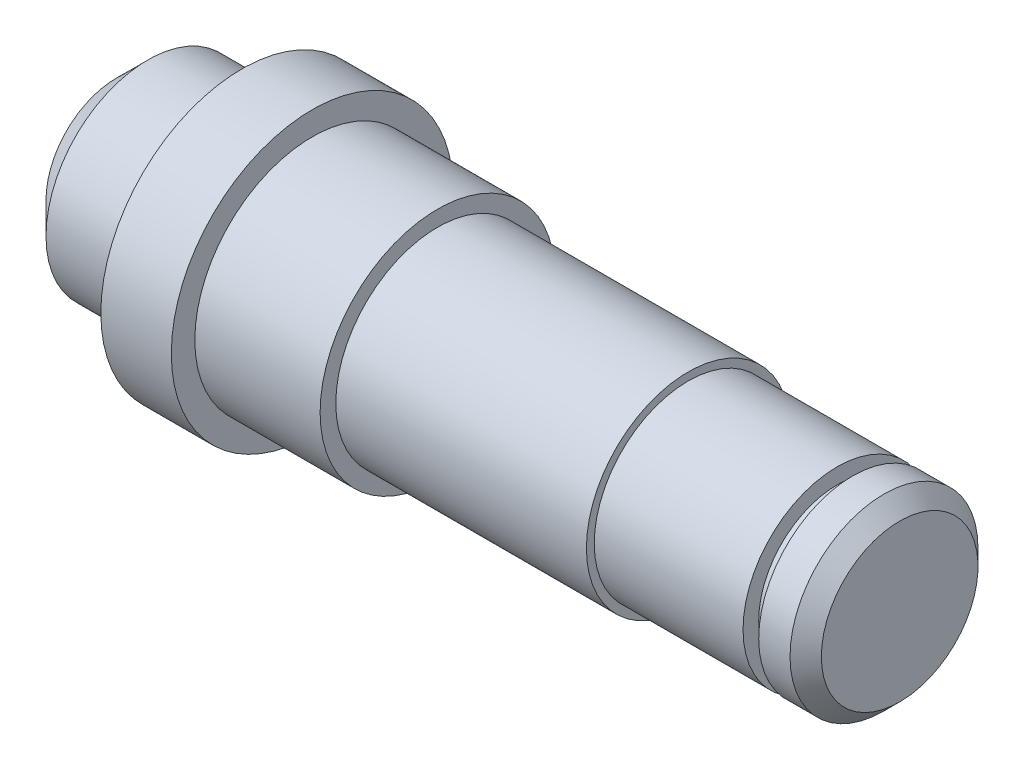
ISO-10303-21;
HEADER;
FILE_DESCRIPTION(('STEP AP214'),'2;1');
FILE_NAME('part.step','',(''),(''),'','','');
FILE_SCHEMA(('AUTOMOTIVE_DESIGN { 1 0 10303 214 1 1 1 1 }'));
ENDSEC;
DATA;
#1=APPLICATION_CONTEXT('core data for automotive mechanical design processes');
#2=APPLICATION_PROTOCOL_DEFINITION('international standard','automotive_design',2000,#1);
#3=PRODUCT_CONTEXT('',#1,'mechanical');
#4=PRODUCT('Part','Part','',(#3));
#5=PRODUCT_RELATED_PRODUCT_CATEGORY('part','',(#4));
#6=PRODUCT_DEFINITION_FORMATION('','',#4);
#7=PRODUCT_DEFINITION_CONTEXT('part definition',#1,'design');
#8=PRODUCT_DEFINITION('design','',#6,#7);
#9=PRODUCT_DEFINITION_SHAPE('','',#8);
#10=(LENGTH_UNIT() NAMED_UNIT(*) SI_UNIT(.MILLI.,.METRE.));
#11=(NAMED_UNIT(*) PLANE_ANGLE_UNIT() SI_UNIT($,.RADIAN.));
#12=(NAMED_UNIT(*) SI_UNIT($,.STERADIAN.) SOLID_ANGLE_UNIT());
#13=UNCERTAINTY_MEASURE_WITH_UNIT(LENGTH_MEASURE(1.E-05),#10,'distance_accuracy_value','');
#14=(GEOMETRIC_REPRESENTATION_CONTEXT(3) GLOBAL_UNCERTAINTY_ASSIGNED_CONTEXT((#13)) GLOBAL_UNIT_ASSIGNED_CONTEXT((#10,
#11,#12)) REPRESENTATION_CONTEXT('',''));
#15=CARTESIAN_POINT('',(0.,0.,0.));
#16=DIRECTION('',(0.,0.,1.));
#17=DIRECTION('',(1.,0.,0.));
#18=AXIS2_PLACEMENT_3D('',#15,#16,#17);
#19=CARTESIAN_POINT('',(0.,0.,0.));
#20=DIRECTION('',(1.,0.,0.));
#21=DIRECTION('',(0.,0.,-1.));
#22=AXIS2_PLACEMENT_3D('',#19,#20,#21);
#23=PLANE('',#22);
#24=CARTESIAN_POINT('',(0.,0.,0.));
#25=DIRECTION('',(-1.,0.,0.));
#26=DIRECTION('',(0.,0.,1.));
#27=AXIS2_PLACEMENT_3D('',#24,#25,#26);
#28=CIRCLE('',#27,4.49999999999999);
#29=CARTESIAN_POINT('',(0.,0.,4.49999999999999));
#30=VERTEX_POINT('',#29);
#31=EDGE_CURVE('E10',#30,#30,#28,.T.);
#32=ORIENTED_EDGE('',*,*,#31,.T.);
#33=EDGE_LOOP('',(#32));
#34=FACE_BOUND('',#33,.T.);
#35=ADVANCED_FACE('F29',(#34),#23,.F.);
#36=CARTESIAN_POINT('',(2.,0.,0.));
#37=DIRECTION('',(1.,0.,0.));
#38=DIRECTION('',(0.,0.,-1.));
#39=AXIS2_PLACEMENT_3D('',#36,#37,#38);
#40=CONICAL_SURFACE('',#39,6.5,0.78539816339745);
#41=ORIENTED_EDGE('',*,*,#31,.F.);
#42=EDGE_LOOP('',(#41));
#43=FACE_BOUND('',#42,.T.);
#44=CARTESIAN_POINT('',(2.,0.,0.));
#45=DIRECTION('',(-1.,0.,0.));
#46=DIRECTION('',(0.,0.,1.));
#47=AXIS2_PLACEMENT_3D('',#44,#45,#46);
#48=CIRCLE('',#47,6.5);
#49=CARTESIAN_POINT('',(2.,0.,6.5));
#50=VERTEX_POINT('',#49);
#51=EDGE_CURVE('E35',#50,#50,#48,.T.);
#52=ORIENTED_EDGE('',*,*,#51,.T.);
#53=EDGE_LOOP('',(#52));
#54=FACE_BOUND('',#53,.T.);
#55=ADVANCED_FACE('F97',(#43,#54),#40,.T.);
#56=CARTESIAN_POINT('',(0.,0.,0.));
#57=DIRECTION('',(-1.,0.,0.));
#58=DIRECTION('',(0.,0.,1.));
#59=AXIS2_PLACEMENT_3D('',#56,#57,#58);
#60=CYLINDRICAL_SURFACE('',#59,6.5);
#61=ORIENTED_EDGE('',*,*,#51,.F.);
#62=EDGE_LOOP('',(#61));
#63=FACE_BOUND('',#62,.T.);
#64=CARTESIAN_POINT('',(8.,0.,0.));
#65=DIRECTION('',(-1.,0.,0.));
#66=DIRECTION('',(0.,0.,1.));
#67=AXIS2_PLACEMENT_3D('',#64,#65,#66);
#68=CIRCLE('',#67,6.5);
#69=CARTESIAN_POINT('',(7.99999999999999,0.,6.5));
#70=VERTEX_POINT('',#69);
#71=EDGE_CURVE('E39',#70,#70,#68,.T.);
#72=ORIENTED_EDGE('',*,*,#71,.T.);
#73=EDGE_LOOP('',(#72));
#74=FACE_BOUND('',#73,.T.);
#75=ADVANCED_FACE('F101',(#63,#74),#60,.T.);
#76=CARTESIAN_POINT('',(8.00000000000007,6.50000000000001,0.));
#77=DIRECTION('',(1.,0.,0.));
#78=DIRECTION('',(0.,0.,-1.));
#79=AXIS2_PLACEMENT_3D('',#76,#77,#78);
#80=PLANE('',#79);
#81=ORIENTED_EDGE('',*,*,#71,.F.);
#82=EDGE_LOOP('',(#81));
#83=FACE_BOUND('',#82,.T.);
#84=CARTESIAN_POINT('',(8.,0.,0.));
#85=DIRECTION('',(-1.,0.,0.));
#86=DIRECTION('',(0.,0.,1.));
#87=AXIS2_PLACEMENT_3D('',#84,#85,#86);
#88=CIRCLE('',#87,9.);
#89=CARTESIAN_POINT('',(7.99999999999999,0.,9.));
#90=VERTEX_POINT('',#89);
#91=EDGE_CURVE('E43',#90,#90,#88,.T.);
#92=ORIENTED_EDGE('',*,*,#91,.T.);
#93=EDGE_LOOP('',(#92));
#94=FACE_BOUND('',#93,.T.);
#95=ADVANCED_FACE('F106',(#83,#94),#80,.F.);
#96=CARTESIAN_POINT('',(0.,0.,0.));
#97=DIRECTION('',(-1.,0.,0.));
#98=DIRECTION('',(0.,0.,1.));
#99=AXIS2_PLACEMENT_3D('',#96,#97,#98);
#100=CYLINDRICAL_SURFACE('',#99,9.);
#101=ORIENTED_EDGE('',*,*,#91,.F.);
#102=EDGE_LOOP('',(#101));
#103=FACE_BOUND('',#102,.T.);
#104=CARTESIAN_POINT('',(12.5,0.,0.));
#105=DIRECTION('',(-1.,0.,0.));
#106=DIRECTION('',(0.,0.,1.));
#107=AXIS2_PLACEMENT_3D('',#104,#105,#106);
#108=CIRCLE('',#107,9.);
#109=CARTESIAN_POINT('',(12.5,0.,8.99999999999999));
#110=VERTEX_POINT('',#109);
#111=EDGE_CURVE('E48',#110,#110,#108,.T.);
#112=ORIENTED_EDGE('',*,*,#111,.T.);
#113=EDGE_LOOP('',(#112));
#114=FACE_BOUND('',#113,.T.);
#115=ADVANCED_FACE('F112',(#103,#114),#100,.T.);
#116=CARTESIAN_POINT('',(12.5,9.00000000000005,0.));
#117=DIRECTION('',(-1.,0.,0.));
#118=DIRECTION('',(0.,0.,1.));
#119=AXIS2_PLACEMENT_3D('',#116,#117,#118);
#120=PLANE('',#119);
#121=ORIENTED_EDGE('',*,*,#111,.F.);
#122=EDGE_LOOP('',(#121));
#123=FACE_BOUND('',#122,.T.);
#124=CARTESIAN_POINT('',(12.5,0.,0.));
#125=DIRECTION('',(-1.,0.,0.));
#126=DIRECTION('',(0.,0.,1.));
#127=AXIS2_PLACEMENT_3D('',#124,#125,#126);
#128=CIRCLE('',#127,7.5);
#129=CARTESIAN_POINT('',(12.5,0.,7.49999999999999));
#130=VERTEX_POINT('',#129);
#131=EDGE_CURVE('E51',#130,#130,#128,.T.);
#132=ORIENTED_EDGE('',*,*,#131,.T.);
#133=EDGE_LOOP('',(#132));
#134=FACE_BOUND('',#133,.T.);
#135=ADVANCED_FACE('F116',(#123,#134),#120,.F.);
#136=CARTESIAN_POINT('',(0.,0.,0.));
#137=DIRECTION('',(-1.,0.,0.));
#138=DIRECTION('',(0.,0.,1.));
#139=AXIS2_PLACEMENT_3D('',#136,#137,#138);
#140=CYLINDRICAL_SURFACE('',#139,7.5);
#141=ORIENTED_EDGE('',*,*,#131,.F.);
#142=EDGE_LOOP('',(#141));
#143=FACE_BOUND('',#142,.T.);
#144=CARTESIAN_POINT('',(20.5,0.,0.));
#145=DIRECTION('',(-1.,0.,0.));
#146=DIRECTION('',(0.,0.,1.));
#147=AXIS2_PLACEMENT_3D('',#144,#145,#146);
#148=CIRCLE('',#147,7.5);
#149=CARTESIAN_POINT('',(20.5,0.,7.49999999999999));
#150=VERTEX_POINT('',#149);
#151=EDGE_CURVE('E54',#150,#150,#148,.T.);
#152=ORIENTED_EDGE('',*,*,#151,.T.);
#153=EDGE_LOOP('',(#152));
#154=FACE_BOUND('',#153,.T.);
#155=ADVANCED_FACE('F120',(#143,#154),#140,.T.);
#156=CARTESIAN_POINT('',(20.5000000000001,7.49999999999999,0.));
#157=DIRECTION('',(-1.,0.,0.));
#158=DIRECTION('',(0.,0.,1.));
#159=AXIS2_PLACEMENT_3D('',#156,#157,#158);
#160=PLANE('',#159);
#161=ORIENTED_EDGE('',*,*,#151,.F.);
#162=EDGE_LOOP('',(#161));
#163=FACE_BOUND('',#162,.T.);
#164=CARTESIAN_POINT('',(20.5,0.,0.));
#165=DIRECTION('',(-1.,0.,0.));
#166=DIRECTION('',(0.,0.,1.));
#167=AXIS2_PLACEMENT_3D('',#164,#165,#166);
#168=CIRCLE('',#167,6.5);
#169=CARTESIAN_POINT('',(20.5,0.,6.49999999999999));
#170=VERTEX_POINT('',#169);
#171=EDGE_CURVE('E57',#170,#170,#168,.T.);
#172=ORIENTED_EDGE('',*,*,#171,.T.);
#173=EDGE_LOOP('',(#172));
#174=FACE_BOUND('',#173,.T.);
#175=ADVANCED_FACE('F124',(#163,#174),#160,.F.);
#176=CARTESIAN_POINT('',(0.,0.,0.));
#177=DIRECTION('',(-1.,0.,0.));
#178=DIRECTION('',(0.,0.,1.));
#179=AXIS2_PLACEMENT_3D('',#176,#177,#178);
#180=CYLINDRICAL_SURFACE('',#179,6.5);
#181=ORIENTED_EDGE('',*,*,#171,.F.);
#182=EDGE_LOOP('',(#181));
#183=FACE_BOUND('',#182,.T.);
#184=CARTESIAN_POINT('',(36.5,0.,0.));
#185=DIRECTION('',(-1.,0.,0.));
#186=DIRECTION('',(0.,0.,1.));
#187=AXIS2_PLACEMENT_3D('',#184,#185,#186);
#188=CIRCLE('',#187,6.5);
#189=CARTESIAN_POINT('',(36.5,0.,6.49999999999996));
#190=VERTEX_POINT('',#189);
#191=EDGE_CURVE('E60',#190,#190,#188,.T.);
#192=ORIENTED_EDGE('',*,*,#191,.T.);
#193=EDGE_LOOP('',(#192));
#194=FACE_BOUND('',#193,.T.);
#195=ADVANCED_FACE('F128',(#183,#194),#180,.T.);
#196=CARTESIAN_POINT('',(36.5,6.49999999999993,0.));
#197=DIRECTION('',(-1.,0.,0.));
#198=DIRECTION('',(0.,0.,1.));
#199=AXIS2_PLACEMENT_3D('',#196,#197,#198);
#200=PLANE('',#199);
#201=ORIENTED_EDGE('',*,*,#191,.F.);
#202=EDGE_LOOP('',(#201));
#203=FACE_BOUND('',#202,.T.);
#204=CARTESIAN_POINT('',(36.5,0.,0.));
#205=DIRECTION('',(-1.,0.,0.));
#206=DIRECTION('',(0.,0.,1.));
#207=AXIS2_PLACEMENT_3D('',#204,#205,#206);
#208=CIRCLE('',#207,6.);
#209=CARTESIAN_POINT('',(36.5,0.,5.99999999999996));
#210=VERTEX_POINT('',#209);
#211=EDGE_CURVE('E63',#210,#210,#208,.T.);
#212=ORIENTED_EDGE('',*,*,#211,.T.);
#213=EDGE_LOOP('',(#212));
#214=FACE_BOUND('',#213,.T.);
#215=ADVANCED_FACE('F132',(#203,#214),#200,.F.);
#216=CARTESIAN_POINT('',(0.,0.,0.));
#217=DIRECTION('',(-1.,0.,0.));
#218=DIRECTION('',(0.,0.,1.));
#219=AXIS2_PLACEMENT_3D('',#216,#217,#218);
#220=CYLINDRICAL_SURFACE('',#219,6.);
#221=ORIENTED_EDGE('',*,*,#211,.F.);
#222=EDGE_LOOP('',(#221));
#223=FACE_BOUND('',#222,.T.);
#224=CARTESIAN_POINT('',(46.,-1.21430643318376E-13,0.));
#225=DIRECTION('',(-1.,0.,0.));
#226=DIRECTION('',(0.,0.,1.));
#227=AXIS2_PLACEMENT_3D('',#224,#225,#226);
#228=CIRCLE('',#227,6.);
#229=CARTESIAN_POINT('',(46.,0.,5.99999999999996));
#230=VERTEX_POINT('',#229);
#231=EDGE_CURVE('E66',#230,#230,#228,.T.);
#232=ORIENTED_EDGE('',*,*,#231,.T.);
#233=EDGE_LOOP('',(#232));
#234=FACE_BOUND('',#233,.T.);
#235=ADVANCED_FACE('F136',(#223,#234),#220,.T.);
#236=CARTESIAN_POINT('',(46.,5.99999999999989,0.));
#237=DIRECTION('',(-1.,0.,0.));
#238=DIRECTION('',(0.,0.,1.));
#239=AXIS2_PLACEMENT_3D('',#236,#237,#238);
#240=PLANE('',#239);
#241=ORIENTED_EDGE('',*,*,#231,.F.);
#242=EDGE_LOOP('',(#241));
#243=FACE_BOUND('',#242,.T.);
#244=CARTESIAN_POINT('',(46.,-1.21430643318376E-13,0.));
#245=DIRECTION('',(-1.,0.,0.));
#246=DIRECTION('',(0.,0.,1.));
#247=AXIS2_PLACEMENT_3D('',#244,#245,#246);
#248=CIRCLE('',#247,5.);
#249=CARTESIAN_POINT('',(46.,-1.03389519168218E-13,4.99999999999996));
#250=VERTEX_POINT('',#249);
#251=EDGE_CURVE('E69',#250,#250,#248,.T.);
#252=ORIENTED_EDGE('',*,*,#251,.T.);
#253=EDGE_LOOP('',(#252));
#254=FACE_BOUND('',#253,.T.);
#255=ADVANCED_FACE('F140',(#243,#254),#240,.F.);
#256=CARTESIAN_POINT('',(0.,0.,0.));
#257=DIRECTION('',(-1.,0.,0.));
#258=DIRECTION('',(0.,0.,1.));
#259=AXIS2_PLACEMENT_3D('',#256,#257,#258);
#260=CYLINDRICAL_SURFACE('',#259,5.);
#261=ORIENTED_EDGE('',*,*,#251,.F.);
#262=EDGE_LOOP('',(#261));
#263=FACE_BOUND('',#262,.T.);
#264=CARTESIAN_POINT('',(47.,-1.17961196366423E-13,0.));
#265=DIRECTION('',(-1.,0.,0.));
#266=DIRECTION('',(0.,0.,1.));
#267=AXIS2_PLACEMENT_3D('',#264,#265,#266);
#268=CIRCLE('',#267,5.);
#269=CARTESIAN_POINT('',(47.,0.,4.99999999999996));
#270=VERTEX_POINT('',#269);
#271=EDGE_CURVE('E72',#270,#270,#268,.T.);
#272=ORIENTED_EDGE('',*,*,#271,.T.);
#273=EDGE_LOOP('',(#272));
#274=FACE_BOUND('',#273,.T.);
#275=ADVANCED_FACE('F144',(#263,#274),#260,.T.);
#276=CARTESIAN_POINT('',(47.,4.99999999999993,0.));
#277=DIRECTION('',(1.,0.,0.));
#278=DIRECTION('',(0.,0.,-1.));
#279=AXIS2_PLACEMENT_3D('',#276,#277,#278);
#280=PLANE('',#279);
#281=ORIENTED_EDGE('',*,*,#271,.F.);
#282=EDGE_LOOP('',(#281));
#283=FACE_BOUND('',#282,.T.);
#284=CARTESIAN_POINT('',(47.,-1.17961196366423E-13,0.));
#285=DIRECTION('',(-1.,0.,0.));
#286=DIRECTION('',(0.,0.,1.));
#287=AXIS2_PLACEMENT_3D('',#284,#285,#286);
#288=CIRCLE('',#287,6.);
#289=CARTESIAN_POINT('',(47.,0.,5.99999999999996));
#290=VERTEX_POINT('',#289);
#291=EDGE_CURVE('E75',#290,#290,#288,.T.);
#292=ORIENTED_EDGE('',*,*,#291,.T.);
#293=EDGE_LOOP('',(#292));
#294=FACE_BOUND('',#293,.T.);
#295=ADVANCED_FACE('F148',(#283,#294),#280,.F.);
#296=CARTESIAN_POINT('',(0.,0.,0.));
#297=DIRECTION('',(-1.,0.,0.));
#298=DIRECTION('',(0.,0.,1.));
#299=AXIS2_PLACEMENT_3D('',#296,#297,#298);
#300=CYLINDRICAL_SURFACE('',#299,6.);
#301=ORIENTED_EDGE('',*,*,#291,.F.);
#302=EDGE_LOOP('',(#301));
#303=FACE_BOUND('',#302,.T.);
#304=CARTESIAN_POINT('',(49.,-1.31838984174237E-13,0.));
#305=DIRECTION('',(-1.,0.,0.));
#306=DIRECTION('',(0.,0.,1.));
#307=AXIS2_PLACEMENT_3D('',#304,#305,#306);
#308=CIRCLE('',#307,6.);
#309=CARTESIAN_POINT('',(49.,-1.10189635194047E-13,5.99999999999994));
#310=VERTEX_POINT('',#309);
#311=EDGE_CURVE('E78',#310,#310,#308,.T.);
#312=ORIENTED_EDGE('',*,*,#311,.T.);
#313=EDGE_LOOP('',(#312));
#314=FACE_BOUND('',#313,.T.);
#315=ADVANCED_FACE('F93',(#303,#314),#300,.T.);
#316=CARTESIAN_POINT('',(50.,-1.21430643318376E-13,0.));
#317=DIRECTION('',(-1.,0.,0.));
#318=DIRECTION('',(0.,0.,1.));
#319=AXIS2_PLACEMENT_3D('',#316,#317,#318);
#320=CONICAL_SURFACE('',#319,5.,0.78539816339745);
#321=ORIENTED_EDGE('',*,*,#311,.F.);
#322=EDGE_LOOP('',(#321));
#323=FACE_BOUND('',#322,.T.);
#324=CARTESIAN_POINT('',(50.,-1.21430643318376E-13,0.));
#325=DIRECTION('',(-1.,0.,0.));
#326=DIRECTION('',(0.,0.,1.));
#327=AXIS2_PLACEMENT_3D('',#324,#325,#326);
#328=CIRCLE('',#327,5.);
#329=CARTESIAN_POINT('',(50.,-1.03389519168218E-13,4.99999999999993));
#330=VERTEX_POINT('',#329);
#331=EDGE_CURVE('E81',#330,#330,#328,.T.);
#332=ORIENTED_EDGE('',*,*,#331,.T.);
#333=EDGE_LOOP('',(#332));
#334=FACE_BOUND('',#333,.T.);
#335=ADVANCED_FACE('F85',(#323,#334),#320,.T.);
#336=CARTESIAN_POINT('',(50.,4.99999999999991,0.));
#337=DIRECTION('',(-1.,0.,0.));
#338=DIRECTION('',(0.,0.,1.));
#339=AXIS2_PLACEMENT_3D('',#336,#337,#338);
#340=PLANE('',#339);
#341=ORIENTED_EDGE('',*,*,#331,.F.);
#342=EDGE_LOOP('',(#341));
#343=FACE_BOUND('',#342,.T.);
#344=ADVANCED_FACE('F87',(#343),#340,.F.);
#345=CLOSED_SHELL('',(#35,#55,#75,#95,#115,#135,#155,#175,#195,#215,#235,#255,#275,#295,#315,
#335,#344));
#346=MANIFOLD_SOLID_BREP('B2',#345);
#347=ADVANCED_BREP_SHAPE_REPRESENTATION('',(#18,#346),#14);
#348=SHAPE_DEFINITION_REPRESENTATION(#9,#347);
ENDSEC;
END-ISO-10303-21;
